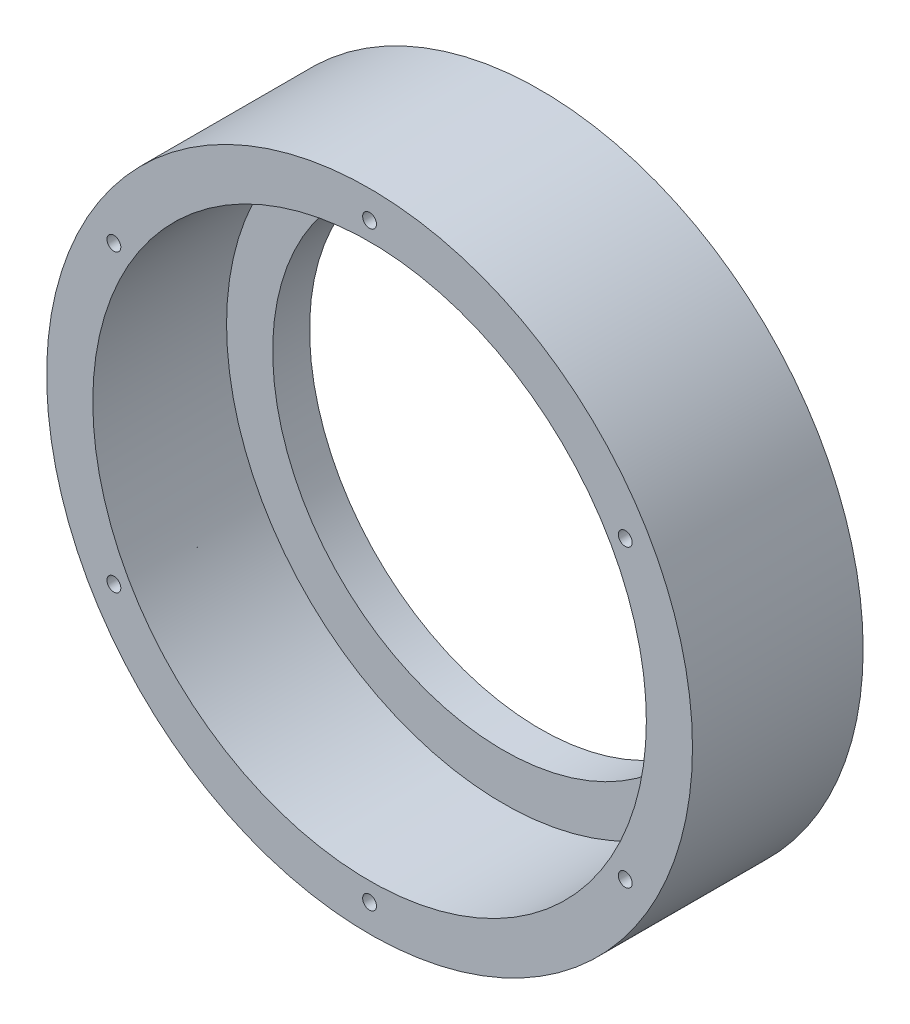
ISO-10303-21;
HEADER;
FILE_DESCRIPTION(('STEP AP214'),'2;1');
FILE_NAME('part.step','',(''),(''),'','','');
FILE_SCHEMA(('AUTOMOTIVE_DESIGN { 1 0 10303 214 1 1 1 1 }'));
ENDSEC;
DATA;
#1=APPLICATION_CONTEXT('core data for automotive mechanical design processes');
#2=APPLICATION_PROTOCOL_DEFINITION('international standard','automotive_design',2000,#1);
#3=PRODUCT_CONTEXT('',#1,'mechanical');
#4=PRODUCT('Part','Part','',(#3));
#5=PRODUCT_RELATED_PRODUCT_CATEGORY('part','',(#4));
#6=PRODUCT_DEFINITION_FORMATION('','',#4);
#7=PRODUCT_DEFINITION_CONTEXT('part definition',#1,'design');
#8=PRODUCT_DEFINITION('design','',#6,#7);
#9=PRODUCT_DEFINITION_SHAPE('','',#8);
#10=(LENGTH_UNIT() NAMED_UNIT(*) SI_UNIT(.MILLI.,.METRE.));
#11=(NAMED_UNIT(*) PLANE_ANGLE_UNIT() SI_UNIT($,.RADIAN.));
#12=(NAMED_UNIT(*) SI_UNIT($,.STERADIAN.) SOLID_ANGLE_UNIT());
#13=UNCERTAINTY_MEASURE_WITH_UNIT(LENGTH_MEASURE(1.E-05),#10,'distance_accuracy_value','');
#14=(GEOMETRIC_REPRESENTATION_CONTEXT(3) GLOBAL_UNCERTAINTY_ASSIGNED_CONTEXT((#13)) GLOBAL_UNIT_ASSIGNED_CONTEXT((#10,
#11,#12)) REPRESENTATION_CONTEXT('',''));
#15=CARTESIAN_POINT('',(0.,0.,0.));
#16=DIRECTION('',(0.,0.,1.));
#17=DIRECTION('',(1.,0.,0.));
#18=AXIS2_PLACEMENT_3D('',#15,#16,#17);
#19=CARTESIAN_POINT('',(0.,0.,8.));
#20=DIRECTION('',(0.,0.,1.));
#21=DIRECTION('',(1.,0.,0.));
#22=AXIS2_PLACEMENT_3D('',#19,#20,#21);
#23=PLANE('',#22);
#24=CARTESIAN_POINT('',(0.,0.,8.));
#25=DIRECTION('',(0.,0.,1.));
#26=DIRECTION('',(1.,0.,0.));
#27=AXIS2_PLACEMENT_3D('',#24,#25,#26);
#28=CIRCLE('',#27,50.);
#29=CARTESIAN_POINT('',(50.,0.,8.));
#30=VERTEX_POINT('',#29);
#31=EDGE_CURVE('E10',#30,#30,#28,.T.);
#32=ORIENTED_EDGE('',*,*,#31,.F.);
#33=EDGE_LOOP('',(#32));
#34=FACE_BOUND('',#33,.T.);
#35=CARTESIAN_POINT('',(0.,0.,8.));
#36=DIRECTION('',(0.,0.,1.));
#37=DIRECTION('',(1.,0.,0.));
#38=AXIS2_PLACEMENT_3D('',#35,#36,#37);
#39=CIRCLE('',#38,60.);
#40=CARTESIAN_POINT('',(-60.,0.,8.));
#41=VERTEX_POINT('',#40);
#42=EDGE_CURVE('E118',#41,#41,#39,.T.);
#43=ORIENTED_EDGE('',*,*,#42,.T.);
#44=EDGE_LOOP('',(#43));
#45=FACE_BOUND('',#44,.T.);
#46=ADVANCED_FACE('F43',(#34,#45),#23,.T.);
#47=CARTESIAN_POINT('',(0.,0.,0.));
#48=DIRECTION('',(0.,0.,1.));
#49=DIRECTION('',(1.,0.,0.));
#50=AXIS2_PLACEMENT_3D('',#47,#48,#49);
#51=PLANE('',#50);
#52=CARTESIAN_POINT('',(0.,0.,0.));
#53=DIRECTION('',(0.,0.,1.));
#54=DIRECTION('',(1.,0.,0.));
#55=AXIS2_PLACEMENT_3D('',#52,#53,#54);
#56=CIRCLE('',#55,50.);
#57=CARTESIAN_POINT('',(50.,0.,0.));
#58=VERTEX_POINT('',#57);
#59=EDGE_CURVE('E47',#58,#58,#56,.T.);
#60=ORIENTED_EDGE('',*,*,#59,.T.);
#61=EDGE_LOOP('',(#60));
#62=FACE_BOUND('',#61,.T.);
#63=CARTESIAN_POINT('',(-55.4256258422039,-32.0000000000003,0.));
#64=DIRECTION('',(0.,0.,-1.));
#65=DIRECTION('',(-1.,0.,0.));
#66=AXIS2_PLACEMENT_3D('',#63,#64,#65);
#67=CIRCLE('',#66,2.75);
#68=CARTESIAN_POINT('',(-58.1756258422039,-32.0000000000003,0.));
#69=VERTEX_POINT('',#68);
#70=EDGE_CURVE('E77',#69,#69,#67,.T.);
#71=ORIENTED_EDGE('',*,*,#70,.F.);
#72=EDGE_LOOP('',(#71));
#73=FACE_BOUND('',#72,.T.);
#74=CARTESIAN_POINT('',(55.4256258422044,-31.9999999999995,0.));
#75=DIRECTION('',(0.,0.,-1.));
#76=DIRECTION('',(-1.,0.,0.));
#77=AXIS2_PLACEMENT_3D('',#74,#75,#76);
#78=CIRCLE('',#77,2.74999999999999);
#79=CARTESIAN_POINT('',(52.6756258422044,-31.9999999999995,0.));
#80=VERTEX_POINT('',#79);
#81=EDGE_CURVE('E69',#80,#80,#78,.T.);
#82=ORIENTED_EDGE('',*,*,#81,.F.);
#83=EDGE_LOOP('',(#82));
#84=FACE_BOUND('',#83,.T.);
#85=CARTESIAN_POINT('',(0.,64.,0.));
#86=DIRECTION('',(0.,0.,-1.));
#87=DIRECTION('',(-1.,0.,0.));
#88=AXIS2_PLACEMENT_3D('',#85,#86,#87);
#89=CIRCLE('',#88,2.75);
#90=CARTESIAN_POINT('',(-2.75,64.,0.));
#91=VERTEX_POINT('',#90);
#92=EDGE_CURVE('E61',#91,#91,#89,.T.);
#93=ORIENTED_EDGE('',*,*,#92,.F.);
#94=EDGE_LOOP('',(#93));
#95=FACE_BOUND('',#94,.T.);
#96=CARTESIAN_POINT('',(0.,0.,0.));
#97=DIRECTION('',(0.,0.,-1.));
#98=DIRECTION('',(-1.,0.,0.));
#99=AXIS2_PLACEMENT_3D('',#96,#97,#98);
#100=CIRCLE('',#99,70.);
#101=CARTESIAN_POINT('',(-70.,0.,0.));
#102=VERTEX_POINT('',#101);
#103=EDGE_CURVE('E56',#102,#102,#100,.T.);
#104=ORIENTED_EDGE('',*,*,#103,.T.);
#105=EDGE_LOOP('',(#104));
#106=FACE_BOUND('',#105,.T.);
#107=CARTESIAN_POINT('',(55.4256258422037,32.0000000000006,0.));
#108=DIRECTION('',(0.,0.,-1.));
#109=DIRECTION('',(-1.,0.,0.));
#110=AXIS2_PLACEMENT_3D('',#107,#108,#109);
#111=CIRCLE('',#110,2.75);
#112=CARTESIAN_POINT('',(52.6756258422037,32.0000000000006,0.));
#113=VERTEX_POINT('',#112);
#114=EDGE_CURVE('E65',#113,#113,#111,.T.);
#115=ORIENTED_EDGE('',*,*,#114,.F.);
#116=EDGE_LOOP('',(#115));
#117=FACE_BOUND('',#116,.T.);
#118=CARTESIAN_POINT('',(0.,-64.,0.));
#119=DIRECTION('',(0.,0.,-1.));
#120=DIRECTION('',(-1.,0.,0.));
#121=AXIS2_PLACEMENT_3D('',#118,#119,#120);
#122=CIRCLE('',#121,2.75);
#123=CARTESIAN_POINT('',(-2.75,-64.,0.));
#124=VERTEX_POINT('',#123);
#125=EDGE_CURVE('E73',#124,#124,#122,.T.);
#126=ORIENTED_EDGE('',*,*,#125,.F.);
#127=EDGE_LOOP('',(#126));
#128=FACE_BOUND('',#127,.T.);
#129=CARTESIAN_POINT('',(-55.4256258422042,31.9999999999999,0.));
#130=DIRECTION('',(0.,0.,-1.));
#131=DIRECTION('',(-1.,0.,0.));
#132=AXIS2_PLACEMENT_3D('',#129,#130,#131);
#133=CIRCLE('',#132,2.75);
#134=CARTESIAN_POINT('',(-58.1756258422042,31.9999999999999,0.));
#135=VERTEX_POINT('',#134);
#136=EDGE_CURVE('E81',#135,#135,#133,.T.);
#137=ORIENTED_EDGE('',*,*,#136,.F.);
#138=EDGE_LOOP('',(#137));
#139=FACE_BOUND('',#138,.T.);
#140=ADVANCED_FACE('F45',(#62,#73,#84,#95,#106,#117,#128,#139),#51,.F.);
#141=CARTESIAN_POINT('',(0.,0.,8.));
#142=DIRECTION('',(0.,0.,-1.));
#143=DIRECTION('',(-1.,0.,0.));
#144=AXIS2_PLACEMENT_3D('',#141,#142,#143);
#145=CYLINDRICAL_SURFACE('',#144,50.);
#146=ORIENTED_EDGE('',*,*,#31,.T.);
#147=EDGE_LOOP('',(#146));
#148=FACE_BOUND('',#147,.T.);
#149=ORIENTED_EDGE('',*,*,#59,.F.);
#150=EDGE_LOOP('',(#149));
#151=FACE_BOUND('',#150,.T.);
#152=ADVANCED_FACE('F194',(#148,#151),#145,.F.);
#153=CARTESIAN_POINT('',(0.,0.,0.));
#154=DIRECTION('',(0.,0.,1.));
#155=DIRECTION('',(1.,0.,0.));
#156=AXIS2_PLACEMENT_3D('',#153,#154,#155);
#157=CYLINDRICAL_SURFACE('',#156,70.);
#158=ORIENTED_EDGE('',*,*,#103,.F.);
#159=EDGE_LOOP('',(#158));
#160=FACE_BOUND('',#159,.T.);
#161=CARTESIAN_POINT('',(0.,0.,37.));
#162=DIRECTION('',(0.,0.,1.));
#163=DIRECTION('',(1.,0.,0.));
#164=AXIS2_PLACEMENT_3D('',#161,#162,#163);
#165=CIRCLE('',#164,70.);
#166=CARTESIAN_POINT('',(70.,0.,37.));
#167=VERTEX_POINT('',#166);
#168=EDGE_CURVE('E85',#167,#167,#165,.T.);
#169=ORIENTED_EDGE('',*,*,#168,.F.);
#170=EDGE_LOOP('',(#169));
#171=FACE_BOUND('',#170,.T.);
#172=ADVANCED_FACE('F200',(#160,#171),#157,.T.);
#173=CARTESIAN_POINT('',(0.,64.,0.));
#174=DIRECTION('',(0.,0.,1.));
#175=DIRECTION('',(1.,0.,0.));
#176=AXIS2_PLACEMENT_3D('',#173,#174,#175);
#177=CYLINDRICAL_SURFACE('',#176,2.75);
#178=ORIENTED_EDGE('',*,*,#92,.T.);
#179=EDGE_LOOP('',(#178));
#180=FACE_BOUND('',#179,.T.);
#181=CARTESIAN_POINT('',(0.,64.,11.));
#182=DIRECTION('',(0.,0.,-1.));
#183=DIRECTION('',(-1.,0.,0.));
#184=AXIS2_PLACEMENT_3D('',#181,#182,#183);
#185=CIRCLE('',#184,2.75);
#186=CARTESIAN_POINT('',(-2.75,64.,11.));
#187=VERTEX_POINT('',#186);
#188=EDGE_CURVE('E113',#187,#187,#185,.T.);
#189=ORIENTED_EDGE('',*,*,#188,.F.);
#190=EDGE_LOOP('',(#189));
#191=FACE_BOUND('',#190,.T.);
#192=ADVANCED_FACE('F203',(#180,#191),#177,.F.);
#193=CARTESIAN_POINT('',(55.4256258422037,32.0000000000006,0.));
#194=DIRECTION('',(0.,0.,1.));
#195=DIRECTION('',(1.,0.,0.));
#196=AXIS2_PLACEMENT_3D('',#193,#194,#195);
#197=CYLINDRICAL_SURFACE('',#196,2.75);
#198=ORIENTED_EDGE('',*,*,#114,.T.);
#199=EDGE_LOOP('',(#198));
#200=FACE_BOUND('',#199,.T.);
#201=CARTESIAN_POINT('',(55.4256258422037,32.0000000000006,11.));
#202=DIRECTION('',(0.,0.,-1.));
#203=DIRECTION('',(-0.50000000000001,0.866025403784433,0.));
#204=AXIS2_PLACEMENT_3D('',#201,#202,#203);
#205=CIRCLE('',#204,2.75);
#206=CARTESIAN_POINT('',(54.0506258422037,34.3815698604078,11.));
#207=VERTEX_POINT('',#206);
#208=EDGE_CURVE('E154',#207,#207,#205,.T.);
#209=ORIENTED_EDGE('',*,*,#208,.F.);
#210=EDGE_LOOP('',(#209));
#211=FACE_BOUND('',#210,.T.);
#212=ADVANCED_FACE('F207',(#200,#211),#197,.F.);
#213=CARTESIAN_POINT('',(55.4256258422044,-31.9999999999995,0.));
#214=DIRECTION('',(0.,0.,1.));
#215=DIRECTION('',(1.,0.,0.));
#216=AXIS2_PLACEMENT_3D('',#213,#214,#215);
#217=CYLINDRICAL_SURFACE('',#216,2.74999999999999);
#218=ORIENTED_EDGE('',*,*,#81,.T.);
#219=EDGE_LOOP('',(#218));
#220=FACE_BOUND('',#219,.T.);
#221=CARTESIAN_POINT('',(55.4256258422044,-31.9999999999995,11.));
#222=DIRECTION('',(0.,0.,-1.));
#223=DIRECTION('',(0.499999999999992,0.866025403784443,0.));
#224=AXIS2_PLACEMENT_3D('',#221,#222,#223);
#225=CIRCLE('',#224,2.75);
#226=CARTESIAN_POINT('',(56.8006258422043,-29.6184301395923,11.));
#227=VERTEX_POINT('',#226);
#228=EDGE_CURVE('E158',#227,#227,#225,.T.);
#229=ORIENTED_EDGE('',*,*,#228,.F.);
#230=EDGE_LOOP('',(#229));
#231=FACE_BOUND('',#230,.T.);
#232=ADVANCED_FACE('F186',(#220,#231),#217,.F.);
#233=CARTESIAN_POINT('',(0.,-64.,0.));
#234=DIRECTION('',(0.,0.,1.));
#235=DIRECTION('',(1.,0.,0.));
#236=AXIS2_PLACEMENT_3D('',#233,#234,#235);
#237=CYLINDRICAL_SURFACE('',#236,2.75);
#238=ORIENTED_EDGE('',*,*,#125,.T.);
#239=EDGE_LOOP('',(#238));
#240=FACE_BOUND('',#239,.T.);
#241=CARTESIAN_POINT('',(0.,-64.,11.));
#242=DIRECTION('',(0.,0.,-1.));
#243=DIRECTION('',(1.,0.,0.));
#244=AXIS2_PLACEMENT_3D('',#241,#242,#243);
#245=CIRCLE('',#244,2.75);
#246=CARTESIAN_POINT('',(2.75,-64.,11.));
#247=VERTEX_POINT('',#246);
#248=EDGE_CURVE('E162',#247,#247,#245,.T.);
#249=ORIENTED_EDGE('',*,*,#248,.F.);
#250=EDGE_LOOP('',(#249));
#251=FACE_BOUND('',#250,.T.);
#252=ADVANCED_FACE('F176',(#240,#251),#237,.F.);
#253=CARTESIAN_POINT('',(-55.4256258422039,-32.0000000000003,0.));
#254=DIRECTION('',(0.,0.,1.));
#255=DIRECTION('',(1.,0.,0.));
#256=AXIS2_PLACEMENT_3D('',#253,#254,#255);
#257=CYLINDRICAL_SURFACE('',#256,2.75);
#258=ORIENTED_EDGE('',*,*,#70,.T.);
#259=EDGE_LOOP('',(#258));
#260=FACE_BOUND('',#259,.T.);
#261=CARTESIAN_POINT('',(-55.4256258422039,-32.0000000000003,11.));
#262=DIRECTION('',(0.,0.,-1.));
#263=DIRECTION('',(0.500000000000004,-0.866025403784436,0.));
#264=AXIS2_PLACEMENT_3D('',#261,#262,#263);
#265=CIRCLE('',#264,2.75);
#266=CARTESIAN_POINT('',(-54.0506258422039,-34.3815698604075,11.));
#267=VERTEX_POINT('',#266);
#268=EDGE_CURVE('E153',#267,#267,#265,.T.);
#269=ORIENTED_EDGE('',*,*,#268,.F.);
#270=EDGE_LOOP('',(#269));
#271=FACE_BOUND('',#270,.T.);
#272=ADVANCED_FACE('F173',(#260,#271),#257,.F.);
#273=CARTESIAN_POINT('',(-55.4256258422042,31.9999999999999,0.));
#274=DIRECTION('',(0.,0.,1.));
#275=DIRECTION('',(1.,0.,0.));
#276=AXIS2_PLACEMENT_3D('',#273,#274,#275);
#277=CYLINDRICAL_SURFACE('',#276,2.75);
#278=ORIENTED_EDGE('',*,*,#136,.T.);
#279=EDGE_LOOP('',(#278));
#280=FACE_BOUND('',#279,.T.);
#281=CARTESIAN_POINT('',(-55.4256258422042,31.9999999999999,11.));
#282=DIRECTION('',(0.,0.,-1.));
#283=DIRECTION('',(-0.499999999999998,-0.86602540378444,0.));
#284=AXIS2_PLACEMENT_3D('',#281,#282,#283);
#285=CIRCLE('',#284,2.75);
#286=CARTESIAN_POINT('',(-56.8006258422041,29.6184301395927,11.));
#287=VERTEX_POINT('',#286);
#288=EDGE_CURVE('E107',#287,#287,#285,.T.);
#289=ORIENTED_EDGE('',*,*,#288,.F.);
#290=EDGE_LOOP('',(#289));
#291=FACE_BOUND('',#290,.T.);
#292=ADVANCED_FACE('F175',(#280,#291),#277,.F.);
#293=CARTESIAN_POINT('',(-55.4256258422042,31.9999999999999,45.));
#294=DIRECTION('',(0.,0.,-1.));
#295=DIRECTION('',(-1.,0.,0.));
#296=AXIS2_PLACEMENT_3D('',#293,#294,#295);
#297=CYLINDRICAL_SURFACE('',#296,1.5);
#298=CARTESIAN_POINT('',(-55.4256258422042,31.9999999999999,37.));
#299=DIRECTION('',(0.,0.,1.));
#300=DIRECTION('',(1.,0.,0.));
#301=AXIS2_PLACEMENT_3D('',#298,#299,#300);
#302=CIRCLE('',#301,1.5);
#303=CARTESIAN_POINT('',(-53.9256258422041,31.9999999999999,37.));
#304=VERTEX_POINT('',#303);
#305=EDGE_CURVE('E90',#304,#304,#302,.T.);
#306=ORIENTED_EDGE('',*,*,#305,.T.);
#307=EDGE_LOOP('',(#306));
#308=FACE_BOUND('',#307,.T.);
#309=CARTESIAN_POINT('',(-55.4256258422042,31.9999999999999,11.));
#310=DIRECTION('',(0.,0.,-1.));
#311=DIRECTION('',(-1.,0.,0.));
#312=AXIS2_PLACEMENT_3D('',#309,#310,#311);
#313=CIRCLE('',#312,1.5);
#314=CARTESIAN_POINT('',(-56.9256258422042,31.9999999999999,11.));
#315=VERTEX_POINT('',#314);
#316=EDGE_CURVE('E86',#315,#315,#313,.F.);
#317=ORIENTED_EDGE('',*,*,#316,.F.);
#318=EDGE_LOOP('',(#317));
#319=FACE_BOUND('',#318,.T.);
#320=ADVANCED_FACE('F183',(#308,#319),#297,.F.);
#321=CARTESIAN_POINT('',(-55.4256258422039,-32.0000000000003,45.));
#322=DIRECTION('',(0.,0.,-1.));
#323=DIRECTION('',(-1.,0.,0.));
#324=AXIS2_PLACEMENT_3D('',#321,#322,#323);
#325=CYLINDRICAL_SURFACE('',#324,1.5);
#326=CARTESIAN_POINT('',(-55.4256258422039,-32.0000000000003,37.));
#327=DIRECTION('',(0.,0.,1.));
#328=DIRECTION('',(1.,0.,0.));
#329=AXIS2_PLACEMENT_3D('',#326,#327,#328);
#330=CIRCLE('',#329,1.5);
#331=CARTESIAN_POINT('',(-53.9256258422039,-32.0000000000003,37.));
#332=VERTEX_POINT('',#331);
#333=EDGE_CURVE('E143',#332,#332,#330,.T.);
#334=ORIENTED_EDGE('',*,*,#333,.T.);
#335=EDGE_LOOP('',(#334));
#336=FACE_BOUND('',#335,.T.);
#337=CARTESIAN_POINT('',(-55.4256258422039,-32.0000000000003,11.));
#338=DIRECTION('',(0.,0.,-1.));
#339=DIRECTION('',(-1.,0.,0.));
#340=AXIS2_PLACEMENT_3D('',#337,#338,#339);
#341=CIRCLE('',#340,1.5);
#342=CARTESIAN_POINT('',(-56.9256258422039,-32.0000000000003,11.));
#343=VERTEX_POINT('',#342);
#344=EDGE_CURVE('E91',#343,#343,#341,.F.);
#345=ORIENTED_EDGE('',*,*,#344,.F.);
#346=EDGE_LOOP('',(#345));
#347=FACE_BOUND('',#346,.T.);
#348=ADVANCED_FACE('F241',(#336,#347),#325,.F.);
#349=CARTESIAN_POINT('',(0.,-64.,45.));
#350=DIRECTION('',(0.,0.,-1.));
#351=DIRECTION('',(-1.,0.,0.));
#352=AXIS2_PLACEMENT_3D('',#349,#350,#351);
#353=CYLINDRICAL_SURFACE('',#352,1.5);
#354=CARTESIAN_POINT('',(0.,-64.,37.));
#355=DIRECTION('',(0.,0.,1.));
#356=DIRECTION('',(1.,0.,0.));
#357=AXIS2_PLACEMENT_3D('',#354,#355,#356);
#358=CIRCLE('',#357,1.5);
#359=CARTESIAN_POINT('',(1.5,-64.,37.));
#360=VERTEX_POINT('',#359);
#361=EDGE_CURVE('E139',#360,#360,#358,.T.);
#362=ORIENTED_EDGE('',*,*,#361,.T.);
#363=EDGE_LOOP('',(#362));
#364=FACE_BOUND('',#363,.T.);
#365=CARTESIAN_POINT('',(0.,-64.,11.));
#366=DIRECTION('',(0.,0.,-1.));
#367=DIRECTION('',(-1.,0.,0.));
#368=AXIS2_PLACEMENT_3D('',#365,#366,#367);
#369=CIRCLE('',#368,1.5);
#370=CARTESIAN_POINT('',(-1.5,-64.,11.));
#371=VERTEX_POINT('',#370);
#372=EDGE_CURVE('E95',#371,#371,#369,.F.);
#373=ORIENTED_EDGE('',*,*,#372,.F.);
#374=EDGE_LOOP('',(#373));
#375=FACE_BOUND('',#374,.T.);
#376=ADVANCED_FACE('F231',(#364,#375),#353,.F.);
#377=CARTESIAN_POINT('',(55.4256258422044,-31.9999999999995,45.));
#378=DIRECTION('',(0.,0.,-1.));
#379=DIRECTION('',(-1.,0.,0.));
#380=AXIS2_PLACEMENT_3D('',#377,#378,#379);
#381=CYLINDRICAL_SURFACE('',#380,1.5);
#382=CARTESIAN_POINT('',(55.4256258422044,-31.9999999999995,37.));
#383=DIRECTION('',(0.,0.,1.));
#384=DIRECTION('',(1.,0.,0.));
#385=AXIS2_PLACEMENT_3D('',#382,#383,#384);
#386=CIRCLE('',#385,1.5);
#387=CARTESIAN_POINT('',(56.9256258422044,-31.9999999999995,37.));
#388=VERTEX_POINT('',#387);
#389=EDGE_CURVE('E135',#388,#388,#386,.T.);
#390=ORIENTED_EDGE('',*,*,#389,.T.);
#391=EDGE_LOOP('',(#390));
#392=FACE_BOUND('',#391,.T.);
#393=CARTESIAN_POINT('',(55.4256258422044,-31.9999999999995,11.));
#394=DIRECTION('',(0.,0.,-1.));
#395=DIRECTION('',(-1.,0.,0.));
#396=AXIS2_PLACEMENT_3D('',#393,#394,#395);
#397=CIRCLE('',#396,1.5);
#398=CARTESIAN_POINT('',(53.9256258422044,-31.9999999999995,11.));
#399=VERTEX_POINT('',#398);
#400=EDGE_CURVE('E99',#399,#399,#397,.F.);
#401=ORIENTED_EDGE('',*,*,#400,.F.);
#402=EDGE_LOOP('',(#401));
#403=FACE_BOUND('',#402,.T.);
#404=ADVANCED_FACE('F228',(#392,#403),#381,.F.);
#405=CARTESIAN_POINT('',(55.4256258422037,32.0000000000006,45.));
#406=DIRECTION('',(0.,0.,-1.));
#407=DIRECTION('',(-1.,0.,0.));
#408=AXIS2_PLACEMENT_3D('',#405,#406,#407);
#409=CYLINDRICAL_SURFACE('',#408,1.5);
#410=CARTESIAN_POINT('',(55.4256258422037,32.0000000000006,37.));
#411=DIRECTION('',(0.,0.,1.));
#412=DIRECTION('',(1.,0.,0.));
#413=AXIS2_PLACEMENT_3D('',#410,#411,#412);
#414=CIRCLE('',#413,1.5);
#415=CARTESIAN_POINT('',(56.9256258422037,32.0000000000006,37.));
#416=VERTEX_POINT('',#415);
#417=EDGE_CURVE('E131',#416,#416,#414,.T.);
#418=ORIENTED_EDGE('',*,*,#417,.T.);
#419=EDGE_LOOP('',(#418));
#420=FACE_BOUND('',#419,.T.);
#421=CARTESIAN_POINT('',(55.4256258422037,32.0000000000006,11.));
#422=DIRECTION('',(0.,0.,-1.));
#423=DIRECTION('',(-1.,0.,0.));
#424=AXIS2_PLACEMENT_3D('',#421,#422,#423);
#425=CIRCLE('',#424,1.5);
#426=CARTESIAN_POINT('',(53.9256258422037,32.0000000000006,11.));
#427=VERTEX_POINT('',#426);
#428=EDGE_CURVE('E103',#427,#427,#425,.F.);
#429=ORIENTED_EDGE('',*,*,#428,.F.);
#430=EDGE_LOOP('',(#429));
#431=FACE_BOUND('',#430,.T.);
#432=ADVANCED_FACE('F230',(#420,#431),#409,.F.);
#433=CARTESIAN_POINT('',(0.,64.,45.));
#434=DIRECTION('',(0.,0.,-1.));
#435=DIRECTION('',(-1.,0.,0.));
#436=AXIS2_PLACEMENT_3D('',#433,#434,#435);
#437=CYLINDRICAL_SURFACE('',#436,1.5);
#438=CARTESIAN_POINT('',(0.,64.,37.));
#439=DIRECTION('',(0.,0.,1.));
#440=DIRECTION('',(1.,0.,0.));
#441=AXIS2_PLACEMENT_3D('',#438,#439,#440);
#442=CIRCLE('',#441,1.5);
#443=CARTESIAN_POINT('',(1.5,64.,37.));
#444=VERTEX_POINT('',#443);
#445=EDGE_CURVE('E112',#444,#444,#442,.T.);
#446=ORIENTED_EDGE('',*,*,#445,.T.);
#447=EDGE_LOOP('',(#446));
#448=FACE_BOUND('',#447,.T.);
#449=CARTESIAN_POINT('',(0.,64.,11.));
#450=DIRECTION('',(0.,0.,-1.));
#451=DIRECTION('',(-1.,0.,0.));
#452=AXIS2_PLACEMENT_3D('',#449,#450,#451);
#453=CIRCLE('',#452,1.5);
#454=CARTESIAN_POINT('',(-1.5,64.,11.));
#455=VERTEX_POINT('',#454);
#456=EDGE_CURVE('E108',#455,#455,#453,.F.);
#457=ORIENTED_EDGE('',*,*,#456,.F.);
#458=EDGE_LOOP('',(#457));
#459=FACE_BOUND('',#458,.T.);
#460=ADVANCED_FACE('F238',(#448,#459),#437,.F.);
#461=CARTESIAN_POINT('',(0.,0.,37.));
#462=DIRECTION('',(0.,0.,1.));
#463=DIRECTION('',(1.,0.,0.));
#464=AXIS2_PLACEMENT_3D('',#461,#462,#463);
#465=PLANE('',#464);
#466=ORIENTED_EDGE('',*,*,#417,.F.);
#467=EDGE_LOOP('',(#466));
#468=FACE_BOUND('',#467,.T.);
#469=ORIENTED_EDGE('',*,*,#389,.F.);
#470=EDGE_LOOP('',(#469));
#471=FACE_BOUND('',#470,.T.);
#472=ORIENTED_EDGE('',*,*,#361,.F.);
#473=EDGE_LOOP('',(#472));
#474=FACE_BOUND('',#473,.T.);
#475=ORIENTED_EDGE('',*,*,#333,.F.);
#476=EDGE_LOOP('',(#475));
#477=FACE_BOUND('',#476,.T.);
#478=ORIENTED_EDGE('',*,*,#305,.F.);
#479=EDGE_LOOP('',(#478));
#480=FACE_BOUND('',#479,.T.);
#481=ORIENTED_EDGE('',*,*,#445,.F.);
#482=EDGE_LOOP('',(#481));
#483=FACE_BOUND('',#482,.T.);
#484=ORIENTED_EDGE('',*,*,#168,.T.);
#485=EDGE_LOOP('',(#484));
#486=FACE_BOUND('',#485,.T.);
#487=CARTESIAN_POINT('',(0.,0.,37.));
#488=DIRECTION('',(0.,0.,1.));
#489=DIRECTION('',(1.,0.,0.));
#490=AXIS2_PLACEMENT_3D('',#487,#488,#489);
#491=CIRCLE('',#490,60.);
#492=CARTESIAN_POINT('',(-60.,0.,37.));
#493=VERTEX_POINT('',#492);
#494=EDGE_CURVE('E117',#493,#493,#491,.T.);
#495=ORIENTED_EDGE('',*,*,#494,.F.);
#496=EDGE_LOOP('',(#495));
#497=FACE_BOUND('',#496,.T.);
#498=ADVANCED_FACE('F256',(#468,#471,#474,#477,#480,#483,#486,#497),#465,.T.);
#499=CARTESIAN_POINT('',(0.,0.,37.));
#500=DIRECTION('',(0.,0.,-1.));
#501=DIRECTION('',(-1.,0.,0.));
#502=AXIS2_PLACEMENT_3D('',#499,#500,#501);
#503=CYLINDRICAL_SURFACE('',#502,60.);
#504=CARTESIAN_POINT('',(-60.,0.,37.));
#505=CARTESIAN_POINT('',(-60.,0.,36.6979166666667));
#506=CARTESIAN_POINT('',(-60.,0.,36.3958333333333));
#507=CARTESIAN_POINT('',(-60.,0.,35.7916666666667));
#508=CARTESIAN_POINT('',(-60.,0.,35.4895833333333));
#509=CARTESIAN_POINT('',(-60.,0.,34.8854166666667));
#510=CARTESIAN_POINT('',(-60.,0.,34.5833333333333));
#511=CARTESIAN_POINT('',(-60.,0.,33.9791666666667));
#512=CARTESIAN_POINT('',(-60.,0.,33.6770833333333));
#513=CARTESIAN_POINT('',(-60.,0.,33.0729166666667));
#514=CARTESIAN_POINT('',(-60.,0.,32.7708333333333));
#515=CARTESIAN_POINT('',(-60.,0.,32.1666666666667));
#516=CARTESIAN_POINT('',(-60.,0.,31.8645833333333));
#517=CARTESIAN_POINT('',(-60.,0.,31.2604166666667));
#518=CARTESIAN_POINT('',(-60.,0.,30.9583333333333));
#519=CARTESIAN_POINT('',(-60.,0.,30.3541666666667));
#520=CARTESIAN_POINT('',(-60.,0.,30.0520833333333));
#521=CARTESIAN_POINT('',(-60.,0.,29.4479166666667));
#522=CARTESIAN_POINT('',(-60.,0.,29.1458333333333));
#523=CARTESIAN_POINT('',(-60.,0.,28.5416666666667));
#524=CARTESIAN_POINT('',(-60.,0.,28.2395833333333));
#525=CARTESIAN_POINT('',(-60.,0.,27.6354166666667));
#526=CARTESIAN_POINT('',(-60.,0.,27.3333333333333));
#527=CARTESIAN_POINT('',(-60.,0.,26.7291666666667));
#528=CARTESIAN_POINT('',(-60.,0.,26.4270833333333));
#529=CARTESIAN_POINT('',(-60.,0.,25.8229166666667));
#530=CARTESIAN_POINT('',(-60.,0.,25.5208333333333));
#531=CARTESIAN_POINT('',(-60.,0.,24.9166666666667));
#532=CARTESIAN_POINT('',(-60.,0.,24.6145833333333));
#533=CARTESIAN_POINT('',(-60.,0.,24.0104166666667));
#534=CARTESIAN_POINT('',(-60.,0.,23.7083333333333));
#535=CARTESIAN_POINT('',(-60.,0.,23.1041666666667));
#536=CARTESIAN_POINT('',(-60.,0.,22.8020833333333));
#537=CARTESIAN_POINT('',(-60.,0.,22.1979166666667));
#538=CARTESIAN_POINT('',(-60.,0.,21.8958333333333));
#539=CARTESIAN_POINT('',(-60.,0.,21.2916666666667));
#540=CARTESIAN_POINT('',(-60.,0.,20.9895833333333));
#541=CARTESIAN_POINT('',(-60.,0.,20.3854166666667));
#542=CARTESIAN_POINT('',(-60.,0.,20.0833333333333));
#543=CARTESIAN_POINT('',(-60.,0.,19.4791666666667));
#544=CARTESIAN_POINT('',(-60.,0.,19.1770833333333));
#545=CARTESIAN_POINT('',(-60.,0.,18.5729166666667));
#546=CARTESIAN_POINT('',(-60.,0.,18.2708333333333));
#547=CARTESIAN_POINT('',(-60.,0.,17.6666666666667));
#548=CARTESIAN_POINT('',(-60.,0.,17.3645833333333));
#549=CARTESIAN_POINT('',(-60.,0.,16.7604166666667));
#550=CARTESIAN_POINT('',(-60.,0.,16.4583333333333));
#551=CARTESIAN_POINT('',(-60.,0.,15.8541666666667));
#552=CARTESIAN_POINT('',(-60.,0.,15.5520833333333));
#553=CARTESIAN_POINT('',(-60.,0.,14.9479166666667));
#554=CARTESIAN_POINT('',(-60.,0.,14.6458333333333));
#555=CARTESIAN_POINT('',(-60.,0.,14.0416666666667));
#556=CARTESIAN_POINT('',(-60.,0.,13.7395833333333));
#557=CARTESIAN_POINT('',(-60.,0.,13.1354166666667));
#558=CARTESIAN_POINT('',(-60.,0.,12.8333333333333));
#559=CARTESIAN_POINT('',(-60.,0.,12.2291666666667));
#560=CARTESIAN_POINT('',(-60.,0.,11.9270833333333));
#561=CARTESIAN_POINT('',(-60.,0.,11.3229166666667));
#562=CARTESIAN_POINT('',(-60.,0.,11.0208333333333));
#563=CARTESIAN_POINT('',(-60.,0.,10.4166666666667));
#564=CARTESIAN_POINT('',(-60.,0.,10.1145833333333));
#565=CARTESIAN_POINT('',(-60.,0.,9.51041666666667));
#566=CARTESIAN_POINT('',(-60.,0.,9.20833333333333));
#567=CARTESIAN_POINT('',(-60.,0.,8.60416666666666));
#568=CARTESIAN_POINT('',(-60.,0.,8.30208333333333));
#569=CARTESIAN_POINT('',(-60.,0.,8.));
#570=B_SPLINE_CURVE_WITH_KNOTS('',3,(#504,#505,#506,#507,#508,#509,#510,#511,#512,#513,#514,
#515,#516,#517,#518,#519,#520,#521,#522,#523,#524,#525,#526,#527,#528,#529,#530,#531,#532,#533,
#534,#535,#536,#537,#538,#539,#540,#541,#542,#543,#544,#545,#546,#547,#548,#549,#550,#551,#552,
#553,#554,#555,#556,#557,#558,#559,#560,#561,#562,#563,#564,#565,#566,#567,#568,#569),
.UNSPECIFIED.,.F.,.F.,(4,2,2,2,2,2,2,2,2,2,2,2,2,2,2,2,2,2,2,2,2,2,2,2,2,2,2,2,2,2,2,2,4),(0.,
0.906250000000004,1.8125,2.71875000000001,3.625,4.53125,5.4375,6.34375000000001,
7.25000000000001,8.15625,9.06250000000001,9.96875000000001,10.875,11.78125,12.6875,13.59375,
14.5,15.40625,16.3125,17.21875,18.125,19.03125,19.9375,20.84375,21.75,22.65625,23.5625,24.46875,
25.375,26.28125,27.1875,28.09375,29.),.UNSPECIFIED.);
#571=EDGE_CURVE('BSEAM252',#493,#41,#570,.T.);
#572=ORIENTED_EDGE('',*,*,#494,.T.);
#573=ORIENTED_EDGE('',*,*,#42,.F.);
#574=ORIENTED_EDGE('',*,*,#571,.T.);
#575=ORIENTED_EDGE('',*,*,#571,.F.);
#576=EDGE_LOOP('',(#572,#574,#573,#575));
#577=FACE_BOUND('',#576,.T.);
#578=ADVANCED_FACE('F252',(#577),#503,.F.);
#579=CARTESIAN_POINT('',(0.,64.,11.));
#580=DIRECTION('',(0.,0.,-1.));
#581=DIRECTION('',(-1.,0.,0.));
#582=AXIS2_PLACEMENT_3D('',#579,#580,#581);
#583=PLANE('',#582);
#584=ORIENTED_EDGE('',*,*,#188,.T.);
#585=EDGE_LOOP('',(#584));
#586=FACE_BOUND('',#585,.T.);
#587=ORIENTED_EDGE('',*,*,#456,.T.);
#588=EDGE_LOOP('',(#587));
#589=FACE_BOUND('',#588,.T.);
#590=ADVANCED_FACE('F249',(#586,#589),#583,.T.);
#591=CARTESIAN_POINT('',(55.4256258422037,32.0000000000006,11.));
#592=DIRECTION('',(0.,0.,-1.));
#593=DIRECTION('',(-0.50000000000001,0.866025403784433,0.));
#594=AXIS2_PLACEMENT_3D('',#591,#592,#593);
#595=PLANE('',#594);
#596=ORIENTED_EDGE('',*,*,#208,.T.);
#597=EDGE_LOOP('',(#596));
#598=FACE_BOUND('',#597,.T.);
#599=ORIENTED_EDGE('',*,*,#428,.T.);
#600=EDGE_LOOP('',(#599));
#601=FACE_BOUND('',#600,.T.);
#602=ADVANCED_FACE('F224',(#598,#601),#595,.T.);
#603=CARTESIAN_POINT('',(55.4256258422044,-31.9999999999995,11.));
#604=DIRECTION('',(0.,0.,-1.));
#605=DIRECTION('',(0.499999999999992,0.866025403784443,0.));
#606=AXIS2_PLACEMENT_3D('',#603,#604,#605);
#607=PLANE('',#606);
#608=ORIENTED_EDGE('',*,*,#228,.T.);
#609=EDGE_LOOP('',(#608));
#610=FACE_BOUND('',#609,.T.);
#611=ORIENTED_EDGE('',*,*,#400,.T.);
#612=EDGE_LOOP('',(#611));
#613=FACE_BOUND('',#612,.T.);
#614=ADVANCED_FACE('F220',(#610,#613),#607,.T.);
#615=CARTESIAN_POINT('',(0.,-64.,11.));
#616=DIRECTION('',(0.,0.,-1.));
#617=DIRECTION('',(1.,0.,0.));
#618=AXIS2_PLACEMENT_3D('',#615,#616,#617);
#619=PLANE('',#618);
#620=ORIENTED_EDGE('',*,*,#248,.T.);
#621=EDGE_LOOP('',(#620));
#622=FACE_BOUND('',#621,.T.);
#623=ORIENTED_EDGE('',*,*,#372,.T.);
#624=EDGE_LOOP('',(#623));
#625=FACE_BOUND('',#624,.T.);
#626=ADVANCED_FACE('F223',(#622,#625),#619,.T.);
#627=CARTESIAN_POINT('',(-55.4256258422039,-32.0000000000003,11.));
#628=DIRECTION('',(0.,0.,-1.));
#629=DIRECTION('',(0.500000000000004,-0.866025403784436,0.));
#630=AXIS2_PLACEMENT_3D('',#627,#628,#629);
#631=PLANE('',#630);
#632=ORIENTED_EDGE('',*,*,#268,.T.);
#633=EDGE_LOOP('',(#632));
#634=FACE_BOUND('',#633,.T.);
#635=ORIENTED_EDGE('',*,*,#344,.T.);
#636=EDGE_LOOP('',(#635));
#637=FACE_BOUND('',#636,.T.);
#638=ADVANCED_FACE('F170',(#634,#637),#631,.T.);
#639=CARTESIAN_POINT('',(-55.4256258422042,31.9999999999999,11.));
#640=DIRECTION('',(0.,0.,-1.));
#641=DIRECTION('',(-0.499999999999998,-0.86602540378444,0.));
#642=AXIS2_PLACEMENT_3D('',#639,#640,#641);
#643=PLANE('',#642);
#644=ORIENTED_EDGE('',*,*,#288,.T.);
#645=EDGE_LOOP('',(#644));
#646=FACE_BOUND('',#645,.T.);
#647=ORIENTED_EDGE('',*,*,#316,.T.);
#648=EDGE_LOOP('',(#647));
#649=FACE_BOUND('',#648,.T.);
#650=ADVANCED_FACE('F289',(#646,#649),#643,.T.);
#651=CLOSED_SHELL('',(#46,#140,#152,#172,#192,#212,#232,#252,#272,#292,#320,#348,#376,#404,#432,
#460,#498,#578,#590,#602,#614,#626,#638,#650));
#652=MANIFOLD_SOLID_BREP('B2',#651);
#653=ADVANCED_BREP_SHAPE_REPRESENTATION('',(#18,#652),#14);
#654=SHAPE_DEFINITION_REPRESENTATION(#9,#653);
ENDSEC;
END-ISO-10303-21;
